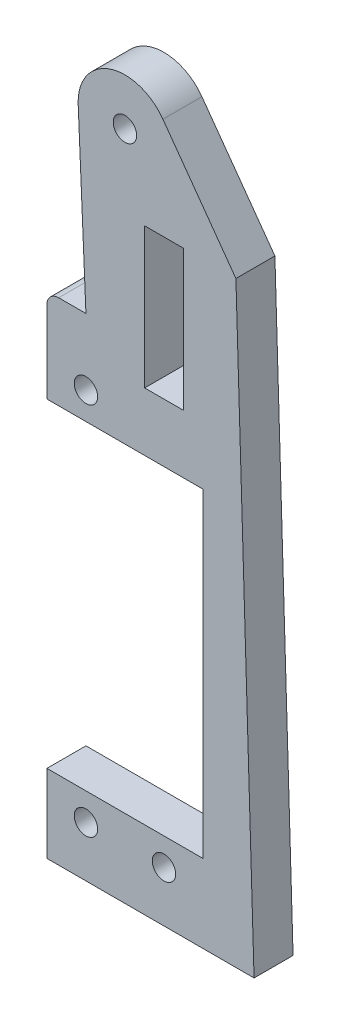
ISO-10303-21;
HEADER;
FILE_DESCRIPTION(('STEP AP214'),'2;1');
FILE_NAME('part.step','',(''),(''),'','','');
FILE_SCHEMA(('AUTOMOTIVE_DESIGN { 1 0 10303 214 1 1 1 1 }'));
ENDSEC;
DATA;
#1=APPLICATION_CONTEXT('core data for automotive mechanical design processes');
#2=APPLICATION_PROTOCOL_DEFINITION('international standard','automotive_design',2000,#1);
#3=PRODUCT_CONTEXT('',#1,'mechanical');
#4=PRODUCT('Part','Part','',(#3));
#5=PRODUCT_RELATED_PRODUCT_CATEGORY('part','',(#4));
#6=PRODUCT_DEFINITION_FORMATION('','',#4);
#7=PRODUCT_DEFINITION_CONTEXT('part definition',#1,'design');
#8=PRODUCT_DEFINITION('design','',#6,#7);
#9=PRODUCT_DEFINITION_SHAPE('','',#8);
#10=(LENGTH_UNIT() NAMED_UNIT(*) SI_UNIT(.MILLI.,.METRE.));
#11=(NAMED_UNIT(*) PLANE_ANGLE_UNIT() SI_UNIT($,.RADIAN.));
#12=(NAMED_UNIT(*) SI_UNIT($,.STERADIAN.) SOLID_ANGLE_UNIT());
#13=UNCERTAINTY_MEASURE_WITH_UNIT(LENGTH_MEASURE(1.E-05),#10,'distance_accuracy_value','');
#14=(GEOMETRIC_REPRESENTATION_CONTEXT(3) GLOBAL_UNCERTAINTY_ASSIGNED_CONTEXT((#13)) GLOBAL_UNIT_ASSIGNED_CONTEXT((#10,
#11,#12)) REPRESENTATION_CONTEXT('',''));
#15=CARTESIAN_POINT('',(0.,0.,0.));
#16=DIRECTION('',(0.,0.,1.));
#17=DIRECTION('',(1.,0.,0.));
#18=AXIS2_PLACEMENT_3D('',#15,#16,#17);
#19=CARTESIAN_POINT('',(17.5288568297002,0.,5.));
#20=DIRECTION('',(-1.,0.,0.));
#21=DIRECTION('',(0.,0.,1.));
#22=AXIS2_PLACEMENT_3D('',#19,#20,#21);
#23=PLANE('',#22);
#24=DIRECTION('',(0.,1.,0.));
#25=VECTOR('',#24,1.);
#26=CARTESIAN_POINT('',(17.5288568297002,0.,0.));
#27=LINE('',#26,#25);
#28=CARTESIAN_POINT('',(17.5288568297002,58.4999999999998,0.));
#29=VERTEX_POINT('',#28);
#30=CARTESIAN_POINT('',(17.5288568297002,76.4999999999998,0.));
#31=VERTEX_POINT('',#30);
#32=EDGE_CURVE('E251',#29,#31,#27,.T.);
#33=ORIENTED_EDGE('',*,*,#32,.F.);
#34=DIRECTION('',(0.,0.,-1.));
#35=VECTOR('',#34,1.);
#36=CARTESIAN_POINT('',(17.5288568297002,58.4999999999998,5.));
#37=LINE('',#36,#35);
#38=CARTESIAN_POINT('',(17.5288568297002,58.4999999999998,5.));
#39=VERTEX_POINT('',#38);
#40=EDGE_CURVE('E273',#39,#29,#37,.T.);
#41=ORIENTED_EDGE('',*,*,#40,.F.);
#42=DIRECTION('',(0.,1.,0.));
#43=VECTOR('',#42,1.);
#44=CARTESIAN_POINT('',(17.5288568297002,0.,5.));
#45=LINE('',#44,#43);
#46=CARTESIAN_POINT('',(17.5288568297002,76.4999999999998,5.));
#47=VERTEX_POINT('',#46);
#48=EDGE_CURVE('E201',#39,#47,#45,.T.);
#49=ORIENTED_EDGE('',*,*,#48,.T.);
#50=DIRECTION('',(0.,0.,-1.));
#51=VECTOR('',#50,1.);
#52=CARTESIAN_POINT('',(17.5288568297002,76.4999999999998,5.));
#53=LINE('',#52,#51);
#54=EDGE_CURVE('E157',#47,#31,#53,.T.);
#55=ORIENTED_EDGE('',*,*,#54,.T.);
#56=EDGE_LOOP('',(#33,#41,#49,#55));
#57=FACE_BOUND('',#56,.T.);
#58=ADVANCED_FACE('F35',(#57),#23,.T.);
#59=CARTESIAN_POINT('',(0.,58.4999999999998,5.));
#60=DIRECTION('',(0.,1.,0.));
#61=DIRECTION('',(0.,0.,1.));
#62=AXIS2_PLACEMENT_3D('',#59,#60,#61);
#63=PLANE('',#62);
#64=DIRECTION('',(1.,0.,0.));
#65=VECTOR('',#64,1.);
#66=CARTESIAN_POINT('',(0.,58.4999999999998,0.));
#67=LINE('',#66,#65);
#68=CARTESIAN_POINT('',(12.5288568297002,58.4999999999998,0.));
#69=VERTEX_POINT('',#68);
#70=EDGE_CURVE('E254',#69,#29,#67,.T.);
#71=ORIENTED_EDGE('',*,*,#70,.F.);
#72=DIRECTION('',(0.,0.,-1.));
#73=VECTOR('',#72,1.);
#74=CARTESIAN_POINT('',(12.5288568297002,58.4999999999998,5.));
#75=LINE('',#74,#73);
#76=CARTESIAN_POINT('',(12.5288568297002,58.4999999999998,5.));
#77=VERTEX_POINT('',#76);
#78=EDGE_CURVE('E271',#77,#69,#75,.T.);
#79=ORIENTED_EDGE('',*,*,#78,.F.);
#80=DIRECTION('',(1.,0.,0.));
#81=VECTOR('',#80,1.);
#82=CARTESIAN_POINT('',(0.,58.4999999999998,5.));
#83=LINE('',#82,#81);
#84=EDGE_CURVE('E204',#77,#39,#83,.T.);
#85=ORIENTED_EDGE('',*,*,#84,.T.);
#86=ORIENTED_EDGE('',*,*,#40,.T.);
#87=EDGE_LOOP('',(#71,#79,#85,#86));
#88=FACE_BOUND('',#87,.T.);
#89=ADVANCED_FACE('F342',(#88),#63,.T.);
#90=CARTESIAN_POINT('',(12.5288568297002,0.,5.));
#91=DIRECTION('',(1.,0.,0.));
#92=DIRECTION('',(0.,1.,0.));
#93=AXIS2_PLACEMENT_3D('',#90,#91,#92);
#94=PLANE('',#93);
#95=DIRECTION('',(0.,-1.,0.));
#96=VECTOR('',#95,1.);
#97=CARTESIAN_POINT('',(12.5288568297002,0.,0.));
#98=LINE('',#97,#96);
#99=CARTESIAN_POINT('',(12.5288568297002,76.4999999999998,0.));
#100=VERTEX_POINT('',#99);
#101=EDGE_CURVE('E257',#100,#69,#98,.T.);
#102=ORIENTED_EDGE('',*,*,#101,.F.);
#103=DIRECTION('',(0.,0.,-1.));
#104=VECTOR('',#103,1.);
#105=CARTESIAN_POINT('',(12.5288568297002,76.4999999999998,5.));
#106=LINE('',#105,#104);
#107=CARTESIAN_POINT('',(12.5288568297002,76.4999999999998,5.));
#108=VERTEX_POINT('',#107);
#109=EDGE_CURVE('E269',#108,#100,#106,.T.);
#110=ORIENTED_EDGE('',*,*,#109,.F.);
#111=DIRECTION('',(0.,-1.,0.));
#112=VECTOR('',#111,1.);
#113=CARTESIAN_POINT('',(12.5288568297002,0.,5.));
#114=LINE('',#113,#112);
#115=EDGE_CURVE('E207',#108,#77,#114,.T.);
#116=ORIENTED_EDGE('',*,*,#115,.T.);
#117=ORIENTED_EDGE('',*,*,#78,.T.);
#118=EDGE_LOOP('',(#102,#110,#116,#117));
#119=FACE_BOUND('',#118,.T.);
#120=ADVANCED_FACE('F348',(#119),#94,.T.);
#121=CARTESIAN_POINT('',(9.99999999999968,85.9999999999998,5.));
#122=DIRECTION('',(0.,0.,-1.));
#123=DIRECTION('',(-1.,0.,0.));
#124=AXIS2_PLACEMENT_3D('',#121,#122,#123);
#125=CYLINDRICAL_SURFACE('',#124,6.00000000000001);
#126=CARTESIAN_POINT('',(9.99999999999968,85.9999999999998,0.));
#127=DIRECTION('',(0.,0.,1.));
#128=DIRECTION('',(1.,0.,0.));
#129=AXIS2_PLACEMENT_3D('',#126,#127,#128);
#130=CIRCLE('',#129,6.00000000000001);
#131=CARTESIAN_POINT('',(4.00572808162328,85.7378851996468,0.));
#132=VERTEX_POINT('',#131);
#133=CARTESIAN_POINT('',(14.8704483134795,89.5041023423583,0.));
#134=VERTEX_POINT('',#133);
#135=EDGE_CURVE('E153',#132,#134,#130,.F.);
#136=ORIENTED_EDGE('',*,*,#135,.F.);
#137=DIRECTION('',(0.,0.,-1.));
#138=VECTOR('',#137,1.);
#139=CARTESIAN_POINT('',(4.00572808162328,85.7378851996468,5.));
#140=LINE('',#139,#138);
#141=CARTESIAN_POINT('',(4.00572808162328,85.7378851996468,5.));
#142=VERTEX_POINT('',#141);
#143=EDGE_CURVE('E146',#142,#132,#140,.T.);
#144=ORIENTED_EDGE('',*,*,#143,.F.);
#145=CARTESIAN_POINT('',(9.99999999999968,85.9999999999998,5.));
#146=DIRECTION('',(0.,0.,1.));
#147=DIRECTION('',(1.,0.,0.));
#148=AXIS2_PLACEMENT_3D('',#145,#146,#147);
#149=CIRCLE('',#148,6.00000000000001);
#150=CARTESIAN_POINT('',(14.8704483134795,89.5041023423583,5.));
#151=VERTEX_POINT('',#150);
#152=EDGE_CURVE('E150',#142,#151,#149,.F.);
#153=ORIENTED_EDGE('',*,*,#152,.T.);
#154=DIRECTION('',(0.,0.,-1.));
#155=VECTOR('',#154,1.);
#156=CARTESIAN_POINT('',(14.8704483134795,89.5041023423583,5.));
#157=LINE('',#156,#155);
#158=EDGE_CURVE('E221',#151,#134,#157,.T.);
#159=ORIENTED_EDGE('',*,*,#158,.T.);
#160=EDGE_LOOP('',(#136,#144,#153,#159));
#161=FACE_BOUND('',#160,.T.);
#162=ADVANCED_FACE('F148',(#161),#125,.T.);
#163=CARTESIAN_POINT('',(7.74003568187344,0.33845276542429,5.));
#164=DIRECTION('',(0.9990453197294,0.0436858000588399,0.));
#165=DIRECTION('',(-0.0436858000588399,0.9990453197294,0.));
#166=AXIS2_PLACEMENT_3D('',#163,#164,#165);
#167=PLANE('',#166);
#168=DIRECTION('',(0.0436858000588399,-0.9990453197294,0.));
#169=VECTOR('',#168,1.);
#170=CARTESIAN_POINT('',(7.74003568187344,0.33845276542429,0.));
#171=LINE('',#170,#169);
#172=CARTESIAN_POINT('',(4.99999999999999,63.,0.));
#173=VERTEX_POINT('',#172);
#174=EDGE_CURVE('E223',#132,#173,#171,.T.);
#175=ORIENTED_EDGE('',*,*,#174,.T.);
#176=DIRECTION('',(0.,0.,-1.));
#177=VECTOR('',#176,1.);
#178=CARTESIAN_POINT('',(4.99999999999999,63.,5.));
#179=LINE('',#178,#177);
#180=CARTESIAN_POINT('',(4.99999999999999,63.,5.));
#181=VERTEX_POINT('',#180);
#182=EDGE_CURVE('E158',#181,#173,#179,.T.);
#183=ORIENTED_EDGE('',*,*,#182,.F.);
#184=DIRECTION('',(0.0436858000588399,-0.9990453197294,0.));
#185=VECTOR('',#184,1.);
#186=CARTESIAN_POINT('',(7.74003568187344,0.33845276542429,5.));
#187=LINE('',#186,#185);
#188=EDGE_CURVE('E162',#142,#181,#187,.T.);
#189=ORIENTED_EDGE('',*,*,#188,.F.);
#190=ORIENTED_EDGE('',*,*,#143,.T.);
#191=EDGE_LOOP('',(#175,#183,#189,#190));
#192=FACE_BOUND('',#191,.T.);
#193=ADVANCED_FACE('F163',(#192),#167,.F.);
#194=CARTESIAN_POINT('',(3.49720252756921E-13,63.,5.));
#195=DIRECTION('',(0.,1.,0.));
#196=DIRECTION('',(-1.,0.,0.));
#197=AXIS2_PLACEMENT_3D('',#194,#195,#196);
#198=PLANE('',#197);
#199=DIRECTION('',(1.,0.,0.));
#200=VECTOR('',#199,1.);
#201=CARTESIAN_POINT('',(3.49720252756921E-13,63.,0.));
#202=LINE('',#201,#200);
#203=CARTESIAN_POINT('',(1.49999999999996,63.,0.));
#204=VERTEX_POINT('',#203);
#205=EDGE_CURVE('E225',#204,#173,#202,.T.);
#206=ORIENTED_EDGE('',*,*,#205,.F.);
#207=DIRECTION('',(0.,0.,-1.));
#208=VECTOR('',#207,1.);
#209=CARTESIAN_POINT('',(1.49999999999996,63.,5.));
#210=LINE('',#209,#208);
#211=CARTESIAN_POINT('',(1.49999999999996,63.,5.));
#212=VERTEX_POINT('',#211);
#213=EDGE_CURVE('E43',#204,#212,#210,.F.);
#214=ORIENTED_EDGE('',*,*,#213,.T.);
#215=DIRECTION('',(1.,0.,0.));
#216=VECTOR('',#215,1.);
#217=CARTESIAN_POINT('',(3.49720252756921E-13,63.,5.));
#218=LINE('',#217,#216);
#219=EDGE_CURVE('E166',#212,#181,#218,.T.);
#220=ORIENTED_EDGE('',*,*,#219,.T.);
#221=ORIENTED_EDGE('',*,*,#182,.T.);
#222=EDGE_LOOP('',(#206,#214,#220,#221));
#223=FACE_BOUND('',#222,.T.);
#224=ADVANCED_FACE('F335',(#223),#198,.T.);
#225=CARTESIAN_POINT('',(0.,0.,5.));
#226=DIRECTION('',(1.,0.,0.));
#227=DIRECTION('',(0.,1.,0.));
#228=AXIS2_PLACEMENT_3D('',#225,#226,#227);
#229=PLANE('',#228);
#230=DIRECTION('',(0.,-1.,0.));
#231=VECTOR('',#230,1.);
#232=CARTESIAN_POINT('',(0.,0.,5.));
#233=LINE('',#232,#231);
#234=CARTESIAN_POINT('',(0.,61.5,5.));
#235=VERTEX_POINT('',#234);
#236=CARTESIAN_POINT('',(0.,51.,5.));
#237=VERTEX_POINT('',#236);
#238=EDGE_CURVE('E180',#235,#237,#233,.T.);
#239=ORIENTED_EDGE('',*,*,#238,.F.);
#240=DIRECTION('',(0.,0.,-1.));
#241=VECTOR('',#240,1.);
#242=CARTESIAN_POINT('',(0.,61.5,0.));
#243=LINE('',#242,#241);
#244=CARTESIAN_POINT('',(0.,61.5,0.));
#245=VERTEX_POINT('',#244);
#246=EDGE_CURVE('E275',#235,#245,#243,.T.);
#247=ORIENTED_EDGE('',*,*,#246,.T.);
#248=DIRECTION('',(0.,-1.,0.));
#249=VECTOR('',#248,1.);
#250=CARTESIAN_POINT('',(0.,0.,0.));
#251=LINE('',#250,#249);
#252=CARTESIAN_POINT('',(0.,51.,0.));
#253=VERTEX_POINT('',#252);
#254=EDGE_CURVE('E227',#245,#253,#251,.T.);
#255=ORIENTED_EDGE('',*,*,#254,.T.);
#256=DIRECTION('',(0.,0.,-1.));
#257=VECTOR('',#256,1.);
#258=CARTESIAN_POINT('',(0.,51.,5.));
#259=LINE('',#258,#257);
#260=EDGE_CURVE('E291',#237,#253,#259,.T.);
#261=ORIENTED_EDGE('',*,*,#260,.F.);
#262=EDGE_LOOP('',(#239,#247,#255,#261));
#263=FACE_BOUND('',#262,.T.);
#264=ADVANCED_FACE('F300',(#263),#229,.F.);
#265=CARTESIAN_POINT('',(0.,51.,5.));
#266=DIRECTION('',(0.,-1.,0.));
#267=DIRECTION('',(0.,0.,-1.));
#268=AXIS2_PLACEMENT_3D('',#265,#266,#267);
#269=PLANE('',#268);
#270=DIRECTION('',(-1.,0.,0.));
#271=VECTOR('',#270,1.);
#272=CARTESIAN_POINT('',(0.,51.,0.));
#273=LINE('',#272,#271);
#274=CARTESIAN_POINT('',(20.,51.,0.));
#275=VERTEX_POINT('',#274);
#276=EDGE_CURVE('E229',#275,#253,#273,.T.);
#277=ORIENTED_EDGE('',*,*,#276,.F.);
#278=DIRECTION('',(0.,0.,-1.));
#279=VECTOR('',#278,1.);
#280=CARTESIAN_POINT('',(20.,51.,5.));
#281=LINE('',#280,#279);
#282=CARTESIAN_POINT('',(20.,51.,5.));
#283=VERTEX_POINT('',#282);
#284=EDGE_CURVE('E289',#283,#275,#281,.T.);
#285=ORIENTED_EDGE('',*,*,#284,.F.);
#286=DIRECTION('',(-1.,0.,0.));
#287=VECTOR('',#286,1.);
#288=CARTESIAN_POINT('',(0.,51.,5.));
#289=LINE('',#288,#287);
#290=EDGE_CURVE('E182',#283,#237,#289,.T.);
#291=ORIENTED_EDGE('',*,*,#290,.T.);
#292=ORIENTED_EDGE('',*,*,#260,.T.);
#293=EDGE_LOOP('',(#277,#285,#291,#292));
#294=FACE_BOUND('',#293,.T.);
#295=ADVANCED_FACE('F310',(#294),#269,.T.);
#296=CARTESIAN_POINT('',(19.9999999999999,0.,5.));
#297=DIRECTION('',(-1.,0.,0.));
#298=DIRECTION('',(0.,-1.,0.));
#299=AXIS2_PLACEMENT_3D('',#296,#297,#298);
#300=PLANE('',#299);
#301=DIRECTION('',(0.,1.,0.));
#302=VECTOR('',#301,1.);
#303=CARTESIAN_POINT('',(19.9999999999999,0.,0.));
#304=LINE('',#303,#302);
#305=CARTESIAN_POINT('',(19.9999999999999,10.,0.));
#306=VERTEX_POINT('',#305);
#307=EDGE_CURVE('E232',#306,#275,#304,.T.);
#308=ORIENTED_EDGE('',*,*,#307,.F.);
#309=DIRECTION('',(0.,0.,-1.));
#310=VECTOR('',#309,1.);
#311=CARTESIAN_POINT('',(19.9999999999999,10.,5.));
#312=LINE('',#311,#310);
#313=CARTESIAN_POINT('',(19.9999999999999,10.,5.));
#314=VERTEX_POINT('',#313);
#315=EDGE_CURVE('E287',#314,#306,#312,.T.);
#316=ORIENTED_EDGE('',*,*,#315,.F.);
#317=DIRECTION('',(0.,1.,0.));
#318=VECTOR('',#317,1.);
#319=CARTESIAN_POINT('',(19.9999999999999,0.,5.));
#320=LINE('',#319,#318);
#321=EDGE_CURVE('E185',#314,#283,#320,.T.);
#322=ORIENTED_EDGE('',*,*,#321,.T.);
#323=ORIENTED_EDGE('',*,*,#284,.T.);
#324=EDGE_LOOP('',(#308,#316,#322,#323));
#325=FACE_BOUND('',#324,.T.);
#326=ADVANCED_FACE('F314',(#325),#300,.T.);
#327=CARTESIAN_POINT('',(0.,10.,5.));
#328=DIRECTION('',(0.,-1.,0.));
#329=DIRECTION('',(1.,0.,0.));
#330=AXIS2_PLACEMENT_3D('',#327,#328,#329);
#331=PLANE('',#330);
#332=DIRECTION('',(-1.,0.,0.));
#333=VECTOR('',#332,1.);
#334=CARTESIAN_POINT('',(0.,10.,0.));
#335=LINE('',#334,#333);
#336=CARTESIAN_POINT('',(0.,10.,0.));
#337=VERTEX_POINT('',#336);
#338=EDGE_CURVE('E235',#306,#337,#335,.T.);
#339=ORIENTED_EDGE('',*,*,#338,.T.);
#340=DIRECTION('',(0.,0.,-1.));
#341=VECTOR('',#340,1.);
#342=CARTESIAN_POINT('',(0.,10.,5.));
#343=LINE('',#342,#341);
#344=CARTESIAN_POINT('',(0.,10.,5.));
#345=VERTEX_POINT('',#344);
#346=EDGE_CURVE('E284',#345,#337,#343,.T.);
#347=ORIENTED_EDGE('',*,*,#346,.F.);
#348=DIRECTION('',(-1.,0.,0.));
#349=VECTOR('',#348,1.);
#350=CARTESIAN_POINT('',(0.,10.,5.));
#351=LINE('',#350,#349);
#352=EDGE_CURVE('E188',#314,#345,#351,.T.);
#353=ORIENTED_EDGE('',*,*,#352,.F.);
#354=ORIENTED_EDGE('',*,*,#315,.T.);
#355=EDGE_LOOP('',(#339,#347,#353,#354));
#356=FACE_BOUND('',#355,.T.);
#357=ADVANCED_FACE('F318',(#356),#331,.F.);
#358=CARTESIAN_POINT('',(0.,0.,5.));
#359=DIRECTION('',(1.,0.,0.));
#360=DIRECTION('',(0.,1.,0.));
#361=AXIS2_PLACEMENT_3D('',#358,#359,#360);
#362=PLANE('',#361);
#363=DIRECTION('',(0.,-1.,0.));
#364=VECTOR('',#363,1.);
#365=CARTESIAN_POINT('',(0.,0.,0.));
#366=LINE('',#365,#364);
#367=CARTESIAN_POINT('',(0.,0.,0.));
#368=VERTEX_POINT('',#367);
#369=EDGE_CURVE('E237',#337,#368,#366,.T.);
#370=ORIENTED_EDGE('',*,*,#369,.T.);
#371=DIRECTION('',(0.,0.,-1.));
#372=VECTOR('',#371,1.);
#373=CARTESIAN_POINT('',(0.,0.,5.));
#374=LINE('',#373,#372);
#375=CARTESIAN_POINT('',(0.,0.,5.));
#376=VERTEX_POINT('',#375);
#377=EDGE_CURVE('E281',#376,#368,#374,.T.);
#378=ORIENTED_EDGE('',*,*,#377,.F.);
#379=DIRECTION('',(0.,-1.,0.));
#380=VECTOR('',#379,1.);
#381=CARTESIAN_POINT('',(0.,0.,5.));
#382=LINE('',#381,#380);
#383=EDGE_CURVE('E190',#345,#376,#382,.T.);
#384=ORIENTED_EDGE('',*,*,#383,.F.);
#385=ORIENTED_EDGE('',*,*,#346,.T.);
#386=EDGE_LOOP('',(#370,#378,#384,#385));
#387=FACE_BOUND('',#386,.T.);
#388=ADVANCED_FACE('F324',(#387),#362,.F.);
#389=CARTESIAN_POINT('',(0.,0.,5.));
#390=DIRECTION('',(0.,1.,0.));
#391=DIRECTION('',(-1.,0.,0.));
#392=AXIS2_PLACEMENT_3D('',#389,#390,#391);
#393=PLANE('',#392);
#394=DIRECTION('',(1.,0.,0.));
#395=VECTOR('',#394,1.);
#396=CARTESIAN_POINT('',(0.,0.,0.));
#397=LINE('',#396,#395);
#398=CARTESIAN_POINT('',(26.5541314453759,0.,0.));
#399=VERTEX_POINT('',#398);
#400=EDGE_CURVE('E239',#368,#399,#397,.T.);
#401=ORIENTED_EDGE('',*,*,#400,.T.);
#402=DIRECTION('',(0.,0.,-1.));
#403=VECTOR('',#402,1.);
#404=CARTESIAN_POINT('',(26.5541314453759,0.,5.));
#405=LINE('',#404,#403);
#406=CARTESIAN_POINT('',(26.5541314453759,0.,5.));
#407=VERTEX_POINT('',#406);
#408=EDGE_CURVE('E279',#407,#399,#405,.T.);
#409=ORIENTED_EDGE('',*,*,#408,.F.);
#410=DIRECTION('',(1.,0.,0.));
#411=VECTOR('',#410,1.);
#412=CARTESIAN_POINT('',(0.,0.,5.));
#413=LINE('',#412,#411);
#414=EDGE_CURVE('E192',#376,#407,#413,.T.);
#415=ORIENTED_EDGE('',*,*,#414,.F.);
#416=ORIENTED_EDGE('',*,*,#377,.T.);
#417=EDGE_LOOP('',(#401,#409,#415,#416));
#418=FACE_BOUND('',#417,.T.);
#419=ADVANCED_FACE('F328',(#418),#393,.F.);
#420=CARTESIAN_POINT('',(26.5295690311156,0.807236188911825,5.));
#421=DIRECTION('',(0.999537395961129,0.0304137152489801,0.));
#422=DIRECTION('',(-0.0304137152489801,0.999537395961129,0.));
#423=AXIS2_PLACEMENT_3D('',#420,#421,#422);
#424=PLANE('',#423);
#425=DIRECTION('',(0.0304137152489801,-0.999537395961129,0.));
#426=VECTOR('',#425,1.);
#427=CARTESIAN_POINT('',(26.5295690311156,0.807236188911825,0.));
#428=LINE('',#427,#426);
#429=CARTESIAN_POINT('',(24.2264054133651,76.4999999999998,0.));
#430=VERTEX_POINT('',#429);
#431=EDGE_CURVE('E242',#430,#399,#428,.T.);
#432=ORIENTED_EDGE('',*,*,#431,.F.);
#433=DIRECTION('',(0.,0.,-1.));
#434=VECTOR('',#433,1.);
#435=CARTESIAN_POINT('',(24.2264054133651,76.4999999999998,5.));
#436=LINE('',#435,#434);
#437=CARTESIAN_POINT('',(24.2264054133651,76.4999999999998,5.));
#438=VERTEX_POINT('',#437);
#439=EDGE_CURVE('E277',#438,#430,#436,.T.);
#440=ORIENTED_EDGE('',*,*,#439,.F.);
#441=DIRECTION('',(0.0304137152489801,-0.999537395961129,0.));
#442=VECTOR('',#441,1.);
#443=CARTESIAN_POINT('',(26.5295690311156,0.807236188911825,5.));
#444=LINE('',#443,#442);
#445=EDGE_CURVE('E194',#438,#407,#444,.T.);
#446=ORIENTED_EDGE('',*,*,#445,.T.);
#447=ORIENTED_EDGE('',*,*,#408,.T.);
#448=EDGE_LOOP('',(#432,#440,#446,#447));
#449=FACE_BOUND('',#448,.T.);
#450=ADVANCED_FACE('F331',(#449),#424,.T.);
#451=CARTESIAN_POINT('',(15.,6.50000000000002,5.));
#452=DIRECTION('',(0.,0.,-1.));
#453=DIRECTION('',(-1.,0.,0.));
#454=AXIS2_PLACEMENT_3D('',#451,#452,#453);
#455=CYLINDRICAL_SURFACE('',#454,1.5);
#456=CARTESIAN_POINT('',(15.,6.50000000000002,5.));
#457=DIRECTION('',(0.,0.,1.));
#458=DIRECTION('',(1.,0.,0.));
#459=AXIS2_PLACEMENT_3D('',#456,#457,#458);
#460=CIRCLE('',#459,1.5);
#461=CARTESIAN_POINT('',(16.5,6.50000000000002,5.));
#462=VERTEX_POINT('',#461);
#463=EDGE_CURVE('E215',#462,#462,#460,.T.);
#464=ORIENTED_EDGE('',*,*,#463,.T.);
#465=EDGE_LOOP('',(#464));
#466=FACE_BOUND('',#465,.T.);
#467=CARTESIAN_POINT('',(15.,6.50000000000002,0.));
#468=DIRECTION('',(0.,0.,1.));
#469=DIRECTION('',(1.,0.,0.));
#470=AXIS2_PLACEMENT_3D('',#467,#468,#469);
#471=CIRCLE('',#470,1.5);
#472=CARTESIAN_POINT('',(16.5,6.50000000000002,0.));
#473=VERTEX_POINT('',#472);
#474=EDGE_CURVE('E176',#473,#473,#471,.T.);
#475=ORIENTED_EDGE('',*,*,#474,.F.);
#476=EDGE_LOOP('',(#475));
#477=FACE_BOUND('',#476,.T.);
#478=ADVANCED_FACE('F364',(#466,#477),#455,.F.);
#479=CARTESIAN_POINT('',(4.99999999999995,54.5,5.));
#480=DIRECTION('',(0.,0.,-1.));
#481=DIRECTION('',(-1.,0.,0.));
#482=AXIS2_PLACEMENT_3D('',#479,#480,#481);
#483=CYLINDRICAL_SURFACE('',#482,1.5);
#484=CARTESIAN_POINT('',(4.99999999999995,54.5,5.));
#485=DIRECTION('',(0.,0.,1.));
#486=DIRECTION('',(1.,0.,0.));
#487=AXIS2_PLACEMENT_3D('',#484,#485,#486);
#488=CIRCLE('',#487,1.5);
#489=CARTESIAN_POINT('',(6.49999999999995,54.5,5.));
#490=VERTEX_POINT('',#489);
#491=EDGE_CURVE('E212',#490,#490,#488,.T.);
#492=ORIENTED_EDGE('',*,*,#491,.T.);
#493=EDGE_LOOP('',(#492));
#494=FACE_BOUND('',#493,.T.);
#495=CARTESIAN_POINT('',(4.99999999999995,54.5,0.));
#496=DIRECTION('',(0.,0.,1.));
#497=DIRECTION('',(1.,0.,0.));
#498=AXIS2_PLACEMENT_3D('',#495,#496,#497);
#499=CIRCLE('',#498,1.5);
#500=CARTESIAN_POINT('',(6.49999999999995,54.5,0.));
#501=VERTEX_POINT('',#500);
#502=EDGE_CURVE('E263',#501,#501,#499,.T.);
#503=ORIENTED_EDGE('',*,*,#502,.F.);
#504=EDGE_LOOP('',(#503));
#505=FACE_BOUND('',#504,.T.);
#506=ADVANCED_FACE('F391',(#494,#505),#483,.F.);
#507=CARTESIAN_POINT('',(0.,76.4999999999998,5.));
#508=DIRECTION('',(0.,1.,0.));
#509=DIRECTION('',(0.,0.,1.));
#510=AXIS2_PLACEMENT_3D('',#507,#508,#509);
#511=PLANE('',#510);
#512=DIRECTION('',(1.,0.,0.));
#513=VECTOR('',#512,1.);
#514=CARTESIAN_POINT('',(0.,76.4999999999998,0.));
#515=LINE('',#514,#513);
#516=EDGE_CURVE('E260',#100,#31,#515,.T.);
#517=ORIENTED_EDGE('',*,*,#516,.T.);
#518=ORIENTED_EDGE('',*,*,#54,.F.);
#519=DIRECTION('',(1.,0.,0.));
#520=VECTOR('',#519,1.);
#521=CARTESIAN_POINT('',(0.,76.4999999999998,5.));
#522=LINE('',#521,#520);
#523=EDGE_CURVE('E210',#108,#47,#522,.T.);
#524=ORIENTED_EDGE('',*,*,#523,.F.);
#525=ORIENTED_EDGE('',*,*,#109,.T.);
#526=EDGE_LOOP('',(#517,#518,#524,#525));
#527=FACE_BOUND('',#526,.T.);
#528=ADVANCED_FACE('F357',(#527),#511,.F.);
#529=CARTESIAN_POINT('',(9.99999999999968,85.9999999999998,5.));
#530=DIRECTION('',(0.,0.,-1.));
#531=DIRECTION('',(-1.,0.,0.));
#532=AXIS2_PLACEMENT_3D('',#529,#530,#531);
#533=CYLINDRICAL_SURFACE('',#532,1.5);
#534=CARTESIAN_POINT('',(9.99999999999968,85.9999999999998,5.));
#535=DIRECTION('',(0.,0.,1.));
#536=DIRECTION('',(1.,0.,0.));
#537=AXIS2_PLACEMENT_3D('',#534,#535,#536);
#538=CIRCLE('',#537,1.5);
#539=CARTESIAN_POINT('',(11.4999999999997,85.9999999999998,5.));
#540=VERTEX_POINT('',#539);
#541=EDGE_CURVE('E198',#540,#540,#538,.T.);
#542=ORIENTED_EDGE('',*,*,#541,.T.);
#543=EDGE_LOOP('',(#542));
#544=FACE_BOUND('',#543,.T.);
#545=CARTESIAN_POINT('',(9.99999999999968,85.9999999999998,0.));
#546=DIRECTION('',(0.,0.,1.));
#547=DIRECTION('',(1.,0.,0.));
#548=AXIS2_PLACEMENT_3D('',#545,#546,#547);
#549=CIRCLE('',#548,1.5);
#550=CARTESIAN_POINT('',(11.4999999999997,85.9999999999998,0.));
#551=VERTEX_POINT('',#550);
#552=EDGE_CURVE('E248',#551,#551,#549,.T.);
#553=ORIENTED_EDGE('',*,*,#552,.F.);
#554=EDGE_LOOP('',(#553));
#555=FACE_BOUND('',#554,.T.);
#556=ADVANCED_FACE('F354',(#544,#555),#533,.F.);
#557=CARTESIAN_POINT('',(52.2297791827129,37.5773398659162,5.));
#558=DIRECTION('',(0.811741385579964,0.58401705705974,0.));
#559=DIRECTION('',(-0.58401705705974,0.811741385579964,0.));
#560=AXIS2_PLACEMENT_3D('',#557,#558,#559);
#561=PLANE('',#560);
#562=DIRECTION('',(0.58401705705974,-0.811741385579964,0.));
#563=VECTOR('',#562,1.);
#564=CARTESIAN_POINT('',(52.2297791827129,37.5773398659162,0.));
#565=LINE('',#564,#563);
#566=EDGE_CURVE('E245',#134,#430,#565,.T.);
#567=ORIENTED_EDGE('',*,*,#566,.F.);
#568=ORIENTED_EDGE('',*,*,#158,.F.);
#569=DIRECTION('',(0.58401705705974,-0.811741385579964,0.));
#570=VECTOR('',#569,1.);
#571=CARTESIAN_POINT('',(52.2297791827129,37.5773398659162,5.));
#572=LINE('',#571,#570);
#573=EDGE_CURVE('E172',#151,#438,#572,.T.);
#574=ORIENTED_EDGE('',*,*,#573,.T.);
#575=ORIENTED_EDGE('',*,*,#439,.T.);
#576=EDGE_LOOP('',(#567,#568,#574,#575));
#577=FACE_BOUND('',#576,.T.);
#578=ADVANCED_FACE('F334',(#577),#561,.T.);
#579=CARTESIAN_POINT('',(4.99999999999995,6.50000000000002,5.));
#580=DIRECTION('',(0.,0.,-1.));
#581=DIRECTION('',(-1.,0.,0.));
#582=AXIS2_PLACEMENT_3D('',#579,#580,#581);
#583=CYLINDRICAL_SURFACE('',#582,1.5);
#584=CARTESIAN_POINT('',(4.99999999999995,6.50000000000002,5.));
#585=DIRECTION('',(0.,0.,1.));
#586=DIRECTION('',(1.,0.,0.));
#587=AXIS2_PLACEMENT_3D('',#584,#585,#586);
#588=CIRCLE('',#587,1.5);
#589=CARTESIAN_POINT('',(6.49999999999995,6.50000000000002,5.));
#590=VERTEX_POINT('',#589);
#591=EDGE_CURVE('E218',#590,#590,#588,.F.);
#592=ORIENTED_EDGE('',*,*,#591,.F.);
#593=EDGE_LOOP('',(#592));
#594=FACE_BOUND('',#593,.T.);
#595=CARTESIAN_POINT('',(4.99999999999995,6.50000000000002,0.));
#596=DIRECTION('',(0.,0.,1.));
#597=DIRECTION('',(1.,0.,0.));
#598=AXIS2_PLACEMENT_3D('',#595,#596,#597);
#599=CIRCLE('',#598,1.5);
#600=CARTESIAN_POINT('',(6.49999999999995,6.50000000000002,0.));
#601=VERTEX_POINT('',#600);
#602=EDGE_CURVE('E173',#601,#601,#599,.F.);
#603=ORIENTED_EDGE('',*,*,#602,.T.);
#604=EDGE_LOOP('',(#603));
#605=FACE_BOUND('',#604,.T.);
#606=ADVANCED_FACE('F361',(#594,#605),#583,.F.);
#607=CARTESIAN_POINT('',(0.,0.,5.));
#608=DIRECTION('',(0.,0.,1.));
#609=DIRECTION('',(1.,0.,0.));
#610=AXIS2_PLACEMENT_3D('',#607,#608,#609);
#611=PLANE('',#610);
#612=ORIENTED_EDGE('',*,*,#219,.F.);
#613=CARTESIAN_POINT('',(1.49999999999995,61.5,5.));
#614=DIRECTION('',(0.,0.,1.));
#615=DIRECTION('',(1.,0.,0.));
#616=AXIS2_PLACEMENT_3D('',#613,#614,#615);
#617=CIRCLE('',#616,1.5);
#618=EDGE_CURVE('E11',#212,#235,#617,.T.);
#619=ORIENTED_EDGE('',*,*,#618,.T.);
#620=ORIENTED_EDGE('',*,*,#238,.T.);
#621=ORIENTED_EDGE('',*,*,#290,.F.);
#622=ORIENTED_EDGE('',*,*,#321,.F.);
#623=ORIENTED_EDGE('',*,*,#352,.T.);
#624=ORIENTED_EDGE('',*,*,#383,.T.);
#625=ORIENTED_EDGE('',*,*,#414,.T.);
#626=ORIENTED_EDGE('',*,*,#445,.F.);
#627=ORIENTED_EDGE('',*,*,#573,.F.);
#628=ORIENTED_EDGE('',*,*,#152,.F.);
#629=ORIENTED_EDGE('',*,*,#188,.T.);
#630=EDGE_LOOP('',(#612,#619,#620,#621,#622,#623,#624,#625,#626,#627,#628,#629));
#631=FACE_BOUND('',#630,.T.);
#632=ORIENTED_EDGE('',*,*,#541,.F.);
#633=EDGE_LOOP('',(#632));
#634=FACE_BOUND('',#633,.T.);
#635=ORIENTED_EDGE('',*,*,#48,.F.);
#636=ORIENTED_EDGE('',*,*,#84,.F.);
#637=ORIENTED_EDGE('',*,*,#115,.F.);
#638=ORIENTED_EDGE('',*,*,#523,.T.);
#639=EDGE_LOOP('',(#635,#636,#637,#638));
#640=FACE_BOUND('',#639,.T.);
#641=ORIENTED_EDGE('',*,*,#491,.F.);
#642=EDGE_LOOP('',(#641));
#643=FACE_BOUND('',#642,.T.);
#644=ORIENTED_EDGE('',*,*,#463,.F.);
#645=EDGE_LOOP('',(#644));
#646=FACE_BOUND('',#645,.T.);
#647=ORIENTED_EDGE('',*,*,#591,.T.);
#648=EDGE_LOOP('',(#647));
#649=FACE_BOUND('',#648,.T.);
#650=ADVANCED_FACE('F168',(#631,#634,#640,#643,#646,#649),#611,.T.);
#651=CARTESIAN_POINT('',(0.,0.,0.));
#652=DIRECTION('',(0.,0.,1.));
#653=DIRECTION('',(1.,0.,0.));
#654=AXIS2_PLACEMENT_3D('',#651,#652,#653);
#655=PLANE('',#654);
#656=ORIENTED_EDGE('',*,*,#254,.F.);
#657=CARTESIAN_POINT('',(1.49999999999995,61.5,0.));
#658=DIRECTION('',(0.,0.,1.));
#659=DIRECTION('',(1.,0.,0.));
#660=AXIS2_PLACEMENT_3D('',#657,#658,#659);
#661=CIRCLE('',#660,1.5);
#662=EDGE_CURVE('E57',#245,#204,#661,.F.);
#663=ORIENTED_EDGE('',*,*,#662,.T.);
#664=ORIENTED_EDGE('',*,*,#205,.T.);
#665=ORIENTED_EDGE('',*,*,#174,.F.);
#666=ORIENTED_EDGE('',*,*,#135,.T.);
#667=ORIENTED_EDGE('',*,*,#566,.T.);
#668=ORIENTED_EDGE('',*,*,#431,.T.);
#669=ORIENTED_EDGE('',*,*,#400,.F.);
#670=ORIENTED_EDGE('',*,*,#369,.F.);
#671=ORIENTED_EDGE('',*,*,#338,.F.);
#672=ORIENTED_EDGE('',*,*,#307,.T.);
#673=ORIENTED_EDGE('',*,*,#276,.T.);
#674=EDGE_LOOP('',(#656,#663,#664,#665,#666,#667,#668,#669,#670,#671,#672,#673));
#675=FACE_BOUND('',#674,.T.);
#676=ORIENTED_EDGE('',*,*,#552,.T.);
#677=EDGE_LOOP('',(#676));
#678=FACE_BOUND('',#677,.T.);
#679=ORIENTED_EDGE('',*,*,#32,.T.);
#680=ORIENTED_EDGE('',*,*,#516,.F.);
#681=ORIENTED_EDGE('',*,*,#101,.T.);
#682=ORIENTED_EDGE('',*,*,#70,.T.);
#683=EDGE_LOOP('',(#679,#680,#681,#682));
#684=FACE_BOUND('',#683,.T.);
#685=ORIENTED_EDGE('',*,*,#502,.T.);
#686=EDGE_LOOP('',(#685));
#687=FACE_BOUND('',#686,.T.);
#688=ORIENTED_EDGE('',*,*,#474,.T.);
#689=EDGE_LOOP('',(#688));
#690=FACE_BOUND('',#689,.T.);
#691=ORIENTED_EDGE('',*,*,#602,.F.);
#692=EDGE_LOOP('',(#691));
#693=FACE_BOUND('',#692,.T.);
#694=ADVANCED_FACE('F304',(#675,#678,#684,#687,#690,#693),#655,.F.);
#695=CARTESIAN_POINT('',(1.49999999999995,61.5,5.));
#696=DIRECTION('',(0.,0.,1.));
#697=DIRECTION('',(1.,0.,0.));
#698=AXIS2_PLACEMENT_3D('',#695,#696,#697);
#699=CYLINDRICAL_SURFACE('',#698,1.5);
#700=ORIENTED_EDGE('',*,*,#618,.F.);
#701=ORIENTED_EDGE('',*,*,#213,.F.);
#702=ORIENTED_EDGE('',*,*,#662,.F.);
#703=ORIENTED_EDGE('',*,*,#246,.F.);
#704=EDGE_LOOP('',(#700,#701,#702,#703));
#705=FACE_BOUND('',#704,.T.);
#706=ADVANCED_FACE('F37',(#705),#699,.T.);
#707=CLOSED_SHELL('',(#58,#89,#120,#162,#193,#224,#264,#295,#326,#357,#388,#419,#450,#478,#506,
#528,#556,#578,#606,#650,#694,#706));
#708=MANIFOLD_SOLID_BREP('B2',#707);
#709=ADVANCED_BREP_SHAPE_REPRESENTATION('',(#18,#708),#14);
#710=SHAPE_DEFINITION_REPRESENTATION(#9,#709);
ENDSEC;
END-ISO-10303-21;
